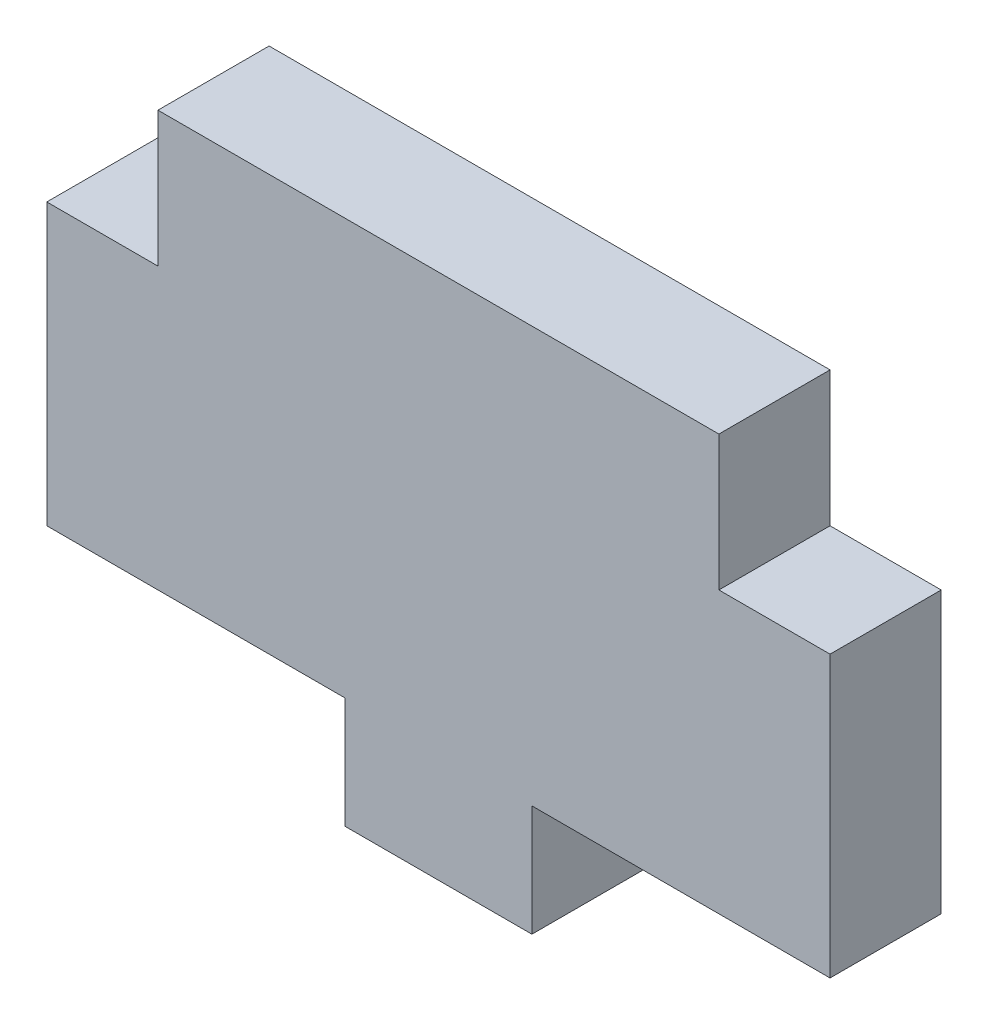
ISO-10303-21;
HEADER;
FILE_DESCRIPTION(('STEP AP214'),'2;1');
FILE_NAME('part.step','',(''),(''),'','','');
FILE_SCHEMA(('AUTOMOTIVE_DESIGN { 1 0 10303 214 1 1 1 1 }'));
ENDSEC;
DATA;
#1=APPLICATION_CONTEXT('core data for automotive mechanical design processes');
#2=APPLICATION_PROTOCOL_DEFINITION('international standard','automotive_design',2000,#1);
#3=PRODUCT_CONTEXT('',#1,'mechanical');
#4=PRODUCT('Part','Part','',(#3));
#5=PRODUCT_RELATED_PRODUCT_CATEGORY('part','',(#4));
#6=PRODUCT_DEFINITION_FORMATION('','',#4);
#7=PRODUCT_DEFINITION_CONTEXT('part definition',#1,'design');
#8=PRODUCT_DEFINITION('design','',#6,#7);
#9=PRODUCT_DEFINITION_SHAPE('','',#8);
#10=(LENGTH_UNIT() NAMED_UNIT(*) SI_UNIT(.MILLI.,.METRE.));
#11=(NAMED_UNIT(*) PLANE_ANGLE_UNIT() SI_UNIT($,.RADIAN.));
#12=(NAMED_UNIT(*) SI_UNIT($,.STERADIAN.) SOLID_ANGLE_UNIT());
#13=UNCERTAINTY_MEASURE_WITH_UNIT(LENGTH_MEASURE(1.E-05),#10,'distance_accuracy_value','');
#14=(GEOMETRIC_REPRESENTATION_CONTEXT(3) GLOBAL_UNCERTAINTY_ASSIGNED_CONTEXT((#13)) GLOBAL_UNIT_ASSIGNED_CONTEXT((#10,
#11,#12)) REPRESENTATION_CONTEXT('',''));
#15=CARTESIAN_POINT('',(0.,0.,0.));
#16=DIRECTION('',(0.,0.,1.));
#17=DIRECTION('',(1.,0.,0.));
#18=AXIS2_PLACEMENT_3D('',#15,#16,#17);
#19=CARTESIAN_POINT('',(32.349998597,18.8500005752,5.35));
#20=DIRECTION('',(-1.,0.,0.));
#21=DIRECTION('',(0.,0.,1.));
#22=AXIS2_PLACEMENT_3D('',#19,#20,#21);
#23=PLANE('',#22);
#24=DIRECTION('',(0.,1.,0.));
#25=VECTOR('',#24,1.);
#26=CARTESIAN_POINT('',(32.349998597,18.8500005752,0.));
#27=LINE('',#26,#25);
#28=CARTESIAN_POINT('',(32.349998597,18.8500005752,0.));
#29=VERTEX_POINT('',#28);
#30=CARTESIAN_POINT('',(32.349998597,25.349999778,0.));
#31=VERTEX_POINT('',#30);
#32=EDGE_CURVE('E153',#29,#31,#27,.T.);
#33=ORIENTED_EDGE('',*,*,#32,.T.);
#34=DIRECTION('',(0.,0.,-1.));
#35=VECTOR('',#34,1.);
#36=CARTESIAN_POINT('',(32.349998597,25.349999778,5.35));
#37=LINE('',#36,#35);
#38=CARTESIAN_POINT('',(32.349998597,25.349999778,5.35));
#39=VERTEX_POINT('',#38);
#40=EDGE_CURVE('E11',#39,#31,#37,.T.);
#41=ORIENTED_EDGE('',*,*,#40,.F.);
#42=DIRECTION('',(0.,1.,0.));
#43=VECTOR('',#42,1.);
#44=CARTESIAN_POINT('',(32.349998597,18.8500005752,5.35));
#45=LINE('',#44,#43);
#46=CARTESIAN_POINT('',(32.349998597,18.8500005752,5.35));
#47=VERTEX_POINT('',#46);
#48=EDGE_CURVE('E175',#47,#39,#45,.T.);
#49=ORIENTED_EDGE('',*,*,#48,.F.);
#50=DIRECTION('',(0.,0.,-1.));
#51=VECTOR('',#50,1.);
#52=CARTESIAN_POINT('',(32.349998597,18.8500005752,5.35));
#53=LINE('',#52,#51);
#54=EDGE_CURVE('E149',#47,#29,#53,.T.);
#55=ORIENTED_EDGE('',*,*,#54,.T.);
#56=EDGE_LOOP('',(#33,#41,#49,#55));
#57=FACE_BOUND('',#56,.T.);
#58=ADVANCED_FACE('F33',(#57),#23,.F.);
#59=CARTESIAN_POINT('',(32.349998597,25.349999778,5.35));
#60=DIRECTION('',(0.,-1.,0.));
#61=DIRECTION('',(0.,0.,-1.));
#62=AXIS2_PLACEMENT_3D('',#59,#60,#61);
#63=PLANE('',#62);
#64=DIRECTION('',(-1.,0.,0.));
#65=VECTOR('',#64,1.);
#66=CARTESIAN_POINT('',(32.349998597,25.349999778,0.));
#67=LINE('',#66,#65);
#68=CARTESIAN_POINT('',(5.35000022500001,25.349999778,0.));
#69=VERTEX_POINT('',#68);
#70=EDGE_CURVE('E156',#31,#69,#67,.T.);
#71=ORIENTED_EDGE('',*,*,#70,.T.);
#72=DIRECTION('',(0.,0.,-1.));
#73=VECTOR('',#72,1.);
#74=CARTESIAN_POINT('',(5.35000022500001,25.349999778,5.35));
#75=LINE('',#74,#73);
#76=CARTESIAN_POINT('',(5.35000022500001,25.349999778,5.35));
#77=VERTEX_POINT('',#76);
#78=EDGE_CURVE('E41',#77,#69,#75,.T.);
#79=ORIENTED_EDGE('',*,*,#78,.F.);
#80=DIRECTION('',(-1.,0.,0.));
#81=VECTOR('',#80,1.);
#82=CARTESIAN_POINT('',(32.349998597,25.349999778,5.35));
#83=LINE('',#82,#81);
#84=EDGE_CURVE('E104',#39,#77,#83,.T.);
#85=ORIENTED_EDGE('',*,*,#84,.F.);
#86=ORIENTED_EDGE('',*,*,#40,.T.);
#87=EDGE_LOOP('',(#71,#79,#85,#86));
#88=FACE_BOUND('',#87,.T.);
#89=ADVANCED_FACE('F253',(#88),#63,.F.);
#90=CARTESIAN_POINT('',(5.35000022500001,25.349999778,5.35));
#91=DIRECTION('',(1.,0.,0.));
#92=DIRECTION('',(0.,0.,-1.));
#93=AXIS2_PLACEMENT_3D('',#90,#91,#92);
#94=PLANE('',#93);
#95=DIRECTION('',(0.,-1.,0.));
#96=VECTOR('',#95,1.);
#97=CARTESIAN_POINT('',(5.35000022500001,25.349999778,0.));
#98=LINE('',#97,#96);
#99=CARTESIAN_POINT('',(5.35000022500001,18.8500005752,0.));
#100=VERTEX_POINT('',#99);
#101=EDGE_CURVE('E158',#69,#100,#98,.T.);
#102=ORIENTED_EDGE('',*,*,#101,.T.);
#103=DIRECTION('',(0.,0.,-1.));
#104=VECTOR('',#103,1.);
#105=CARTESIAN_POINT('',(5.35000022500001,18.8500005752,5.35));
#106=LINE('',#105,#104);
#107=CARTESIAN_POINT('',(5.35000022500001,18.8500005752,5.35));
#108=VERTEX_POINT('',#107);
#109=EDGE_CURVE('E194',#108,#100,#106,.T.);
#110=ORIENTED_EDGE('',*,*,#109,.F.);
#111=DIRECTION('',(0.,-1.,0.));
#112=VECTOR('',#111,1.);
#113=CARTESIAN_POINT('',(5.35000022500001,25.349999778,5.35));
#114=LINE('',#113,#112);
#115=EDGE_CURVE('E202',#77,#108,#114,.T.);
#116=ORIENTED_EDGE('',*,*,#115,.F.);
#117=ORIENTED_EDGE('',*,*,#78,.T.);
#118=EDGE_LOOP('',(#102,#110,#116,#117));
#119=FACE_BOUND('',#118,.T.);
#120=ADVANCED_FACE('F200',(#119),#94,.F.);
#121=CARTESIAN_POINT('',(5.35000022500001,18.8500005752,5.35));
#122=DIRECTION('',(0.,-1.,0.));
#123=DIRECTION('',(0.,0.,-1.));
#124=AXIS2_PLACEMENT_3D('',#121,#122,#123);
#125=PLANE('',#124);
#126=DIRECTION('',(-1.,0.,0.));
#127=VECTOR('',#126,1.);
#128=CARTESIAN_POINT('',(5.35000022500001,18.8500005752,0.));
#129=LINE('',#128,#127);
#130=CARTESIAN_POINT('',(0.,18.8500005752,0.));
#131=VERTEX_POINT('',#130);
#132=EDGE_CURVE('E160',#100,#131,#129,.T.);
#133=ORIENTED_EDGE('',*,*,#132,.T.);
#134=DIRECTION('',(0.,0.,-1.));
#135=VECTOR('',#134,1.);
#136=CARTESIAN_POINT('',(0.,18.8500005752,5.35));
#137=LINE('',#136,#135);
#138=CARTESIAN_POINT('',(0.,18.8500005752,5.35));
#139=VERTEX_POINT('',#138);
#140=EDGE_CURVE('E191',#139,#131,#137,.T.);
#141=ORIENTED_EDGE('',*,*,#140,.F.);
#142=DIRECTION('',(-1.,0.,0.));
#143=VECTOR('',#142,1.);
#144=CARTESIAN_POINT('',(5.35000022500001,18.8500005752,5.35));
#145=LINE('',#144,#143);
#146=EDGE_CURVE('E220',#108,#139,#145,.T.);
#147=ORIENTED_EDGE('',*,*,#146,.F.);
#148=ORIENTED_EDGE('',*,*,#109,.T.);
#149=EDGE_LOOP('',(#133,#141,#147,#148));
#150=FACE_BOUND('',#149,.T.);
#151=ADVANCED_FACE('F211',(#150),#125,.F.);
#152=CARTESIAN_POINT('',(0.,18.8500005752,5.35));
#153=DIRECTION('',(1.,0.,0.));
#154=DIRECTION('',(0.,0.,-1.));
#155=AXIS2_PLACEMENT_3D('',#152,#153,#154);
#156=PLANE('',#155);
#157=DIRECTION('',(0.,-1.,0.));
#158=VECTOR('',#157,1.);
#159=CARTESIAN_POINT('',(0.,18.8500005752,0.));
#160=LINE('',#159,#158);
#161=CARTESIAN_POINT('',(0.,5.350000225,0.));
#162=VERTEX_POINT('',#161);
#163=EDGE_CURVE('E162',#131,#162,#160,.T.);
#164=ORIENTED_EDGE('',*,*,#163,.T.);
#165=DIRECTION('',(0.,0.,-1.));
#166=VECTOR('',#165,1.);
#167=CARTESIAN_POINT('',(0.,5.350000225,5.35));
#168=LINE('',#167,#166);
#169=CARTESIAN_POINT('',(0.,5.350000225,5.35));
#170=VERTEX_POINT('',#169);
#171=EDGE_CURVE('E188',#170,#162,#168,.T.);
#172=ORIENTED_EDGE('',*,*,#171,.F.);
#173=DIRECTION('',(0.,-1.,0.));
#174=VECTOR('',#173,1.);
#175=CARTESIAN_POINT('',(0.,18.8500005752,5.35));
#176=LINE('',#175,#174);
#177=EDGE_CURVE('E217',#139,#170,#176,.T.);
#178=ORIENTED_EDGE('',*,*,#177,.F.);
#179=ORIENTED_EDGE('',*,*,#140,.T.);
#180=EDGE_LOOP('',(#164,#172,#178,#179));
#181=FACE_BOUND('',#180,.T.);
#182=ADVANCED_FACE('F215',(#181),#156,.F.);
#183=CARTESIAN_POINT('',(0.,5.350000225,5.35));
#184=DIRECTION('',(0.,1.,0.));
#185=DIRECTION('',(0.,0.,1.));
#186=AXIS2_PLACEMENT_3D('',#183,#184,#185);
#187=PLANE('',#186);
#188=DIRECTION('',(1.,0.,0.));
#189=VECTOR('',#188,1.);
#190=CARTESIAN_POINT('',(0.,5.350000225,0.));
#191=LINE('',#190,#189);
#192=CARTESIAN_POINT('',(14.3499993719,5.350000225,0.));
#193=VERTEX_POINT('',#192);
#194=EDGE_CURVE('E164',#162,#193,#191,.T.);
#195=ORIENTED_EDGE('',*,*,#194,.T.);
#196=DIRECTION('',(0.,0.,-1.));
#197=VECTOR('',#196,1.);
#198=CARTESIAN_POINT('',(14.3499993719,5.350000225,5.35));
#199=LINE('',#198,#197);
#200=CARTESIAN_POINT('',(14.3499993719,5.350000225,5.35));
#201=VERTEX_POINT('',#200);
#202=EDGE_CURVE('E185',#201,#193,#199,.T.);
#203=ORIENTED_EDGE('',*,*,#202,.F.);
#204=DIRECTION('',(1.,0.,0.));
#205=VECTOR('',#204,1.);
#206=CARTESIAN_POINT('',(0.,5.350000225,5.35));
#207=LINE('',#206,#205);
#208=EDGE_CURVE('E219',#170,#201,#207,.T.);
#209=ORIENTED_EDGE('',*,*,#208,.F.);
#210=ORIENTED_EDGE('',*,*,#171,.T.);
#211=EDGE_LOOP('',(#195,#203,#209,#210));
#212=FACE_BOUND('',#211,.T.);
#213=ADVANCED_FACE('F266',(#212),#187,.F.);
#214=CARTESIAN_POINT('',(14.3499993719,5.350000225,5.35));
#215=DIRECTION('',(1.,0.,0.));
#216=DIRECTION('',(0.,0.,-1.));
#217=AXIS2_PLACEMENT_3D('',#214,#215,#216);
#218=PLANE('',#217);
#219=DIRECTION('',(0.,-1.,0.));
#220=VECTOR('',#219,1.);
#221=CARTESIAN_POINT('',(14.3499993719,5.350000225,0.));
#222=LINE('',#221,#220);
#223=CARTESIAN_POINT('',(14.3499993719,0.,0.));
#224=VERTEX_POINT('',#223);
#225=EDGE_CURVE('E166',#193,#224,#222,.T.);
#226=ORIENTED_EDGE('',*,*,#225,.T.);
#227=DIRECTION('',(0.,0.,-1.));
#228=VECTOR('',#227,1.);
#229=CARTESIAN_POINT('',(14.3499993719,0.,5.35));
#230=LINE('',#229,#228);
#231=CARTESIAN_POINT('',(14.3499993719,0.,5.35));
#232=VERTEX_POINT('',#231);
#233=EDGE_CURVE('E182',#232,#224,#230,.T.);
#234=ORIENTED_EDGE('',*,*,#233,.F.);
#235=DIRECTION('',(0.,-1.,0.));
#236=VECTOR('',#235,1.);
#237=CARTESIAN_POINT('',(14.3499993719,5.350000225,5.35));
#238=LINE('',#237,#236);
#239=EDGE_CURVE('E222',#201,#232,#238,.T.);
#240=ORIENTED_EDGE('',*,*,#239,.F.);
#241=ORIENTED_EDGE('',*,*,#202,.T.);
#242=EDGE_LOOP('',(#226,#234,#240,#241));
#243=FACE_BOUND('',#242,.T.);
#244=ADVANCED_FACE('F269',(#243),#218,.F.);
#245=CARTESIAN_POINT('',(14.3499993719,0.,5.35));
#246=DIRECTION('',(0.,1.,0.));
#247=DIRECTION('',(0.,0.,1.));
#248=AXIS2_PLACEMENT_3D('',#245,#246,#247);
#249=PLANE('',#248);
#250=DIRECTION('',(1.,0.,0.));
#251=VECTOR('',#250,1.);
#252=CARTESIAN_POINT('',(14.3499993719,0.,0.));
#253=LINE('',#252,#251);
#254=CARTESIAN_POINT('',(23.3500008471,0.,0.));
#255=VERTEX_POINT('',#254);
#256=EDGE_CURVE('E168',#224,#255,#253,.T.);
#257=ORIENTED_EDGE('',*,*,#256,.T.);
#258=DIRECTION('',(0.,0.,-1.));
#259=VECTOR('',#258,1.);
#260=CARTESIAN_POINT('',(23.3500008471,0.,5.35));
#261=LINE('',#260,#259);
#262=CARTESIAN_POINT('',(23.3500008471,0.,5.35));
#263=VERTEX_POINT('',#262);
#264=EDGE_CURVE('E179',#263,#255,#261,.T.);
#265=ORIENTED_EDGE('',*,*,#264,.F.);
#266=DIRECTION('',(1.,0.,0.));
#267=VECTOR('',#266,1.);
#268=CARTESIAN_POINT('',(14.3499993719,0.,5.35));
#269=LINE('',#268,#267);
#270=EDGE_CURVE('E228',#232,#263,#269,.T.);
#271=ORIENTED_EDGE('',*,*,#270,.F.);
#272=ORIENTED_EDGE('',*,*,#233,.T.);
#273=EDGE_LOOP('',(#257,#265,#271,#272));
#274=FACE_BOUND('',#273,.T.);
#275=ADVANCED_FACE('F234',(#274),#249,.F.);
#276=CARTESIAN_POINT('',(23.3500008471,0.,5.35));
#277=DIRECTION('',(-1.,0.,0.));
#278=DIRECTION('',(0.,0.,1.));
#279=AXIS2_PLACEMENT_3D('',#276,#277,#278);
#280=PLANE('',#279);
#281=DIRECTION('',(0.,1.,0.));
#282=VECTOR('',#281,1.);
#283=CARTESIAN_POINT('',(23.3500008471,0.,0.));
#284=LINE('',#283,#282);
#285=CARTESIAN_POINT('',(23.3500008471,5.350000225,0.));
#286=VERTEX_POINT('',#285);
#287=EDGE_CURVE('E170',#255,#286,#284,.T.);
#288=ORIENTED_EDGE('',*,*,#287,.T.);
#289=DIRECTION('',(0.,0.,-1.));
#290=VECTOR('',#289,1.);
#291=CARTESIAN_POINT('',(23.3500008471,5.350000225,5.35));
#292=LINE('',#291,#290);
#293=CARTESIAN_POINT('',(23.3500008471,5.350000225,5.35));
#294=VERTEX_POINT('',#293);
#295=EDGE_CURVE('E144',#294,#286,#292,.T.);
#296=ORIENTED_EDGE('',*,*,#295,.F.);
#297=DIRECTION('',(0.,1.,0.));
#298=VECTOR('',#297,1.);
#299=CARTESIAN_POINT('',(23.3500008471,0.,5.35));
#300=LINE('',#299,#298);
#301=EDGE_CURVE('E135',#263,#294,#300,.T.);
#302=ORIENTED_EDGE('',*,*,#301,.F.);
#303=ORIENTED_EDGE('',*,*,#264,.T.);
#304=EDGE_LOOP('',(#288,#296,#302,#303));
#305=FACE_BOUND('',#304,.T.);
#306=ADVANCED_FACE('F238',(#305),#280,.F.);
#307=CARTESIAN_POINT('',(23.3500008471,5.350000225,5.35));
#308=DIRECTION('',(0.,1.,0.));
#309=DIRECTION('',(0.,0.,1.));
#310=AXIS2_PLACEMENT_3D('',#307,#308,#309);
#311=PLANE('',#310);
#312=DIRECTION('',(1.,0.,0.));
#313=VECTOR('',#312,1.);
#314=CARTESIAN_POINT('',(23.3500008471,5.350000225,0.));
#315=LINE('',#314,#313);
#316=CARTESIAN_POINT('',(37.6999997534001,5.350000225,0.));
#317=VERTEX_POINT('',#316);
#318=EDGE_CURVE('E143',#286,#317,#315,.T.);
#319=ORIENTED_EDGE('',*,*,#318,.T.);
#320=DIRECTION('',(0.,0.,-1.));
#321=VECTOR('',#320,1.);
#322=CARTESIAN_POINT('',(37.6999997534001,5.350000225,5.35));
#323=LINE('',#322,#321);
#324=CARTESIAN_POINT('',(37.6999997534001,5.350000225,5.35));
#325=VERTEX_POINT('',#324);
#326=EDGE_CURVE('E140',#325,#317,#323,.T.);
#327=ORIENTED_EDGE('',*,*,#326,.F.);
#328=DIRECTION('',(1.,0.,0.));
#329=VECTOR('',#328,1.);
#330=CARTESIAN_POINT('',(23.3500008471,5.350000225,5.35));
#331=LINE('',#330,#329);
#332=EDGE_CURVE('E129',#294,#325,#331,.T.);
#333=ORIENTED_EDGE('',*,*,#332,.F.);
#334=ORIENTED_EDGE('',*,*,#295,.T.);
#335=EDGE_LOOP('',(#319,#327,#333,#334));
#336=FACE_BOUND('',#335,.T.);
#337=ADVANCED_FACE('F141',(#336),#311,.F.);
#338=CARTESIAN_POINT('',(37.6999997534001,5.350000225,5.35));
#339=DIRECTION('',(-1.,0.,0.));
#340=DIRECTION('',(0.,0.,1.));
#341=AXIS2_PLACEMENT_3D('',#338,#339,#340);
#342=PLANE('',#341);
#343=DIRECTION('',(0.,1.,0.));
#344=VECTOR('',#343,1.);
#345=CARTESIAN_POINT('',(37.6999997534001,5.350000225,0.));
#346=LINE('',#345,#344);
#347=CARTESIAN_POINT('',(37.6999997534001,18.8500005752,0.));
#348=VERTEX_POINT('',#347);
#349=EDGE_CURVE('E90',#317,#348,#346,.T.);
#350=ORIENTED_EDGE('',*,*,#349,.T.);
#351=DIRECTION('',(0.,0.,-1.));
#352=VECTOR('',#351,1.);
#353=CARTESIAN_POINT('',(37.6999997534001,18.8500005752,5.35));
#354=LINE('',#353,#352);
#355=CARTESIAN_POINT('',(37.6999997534001,18.8500005752,5.35));
#356=VERTEX_POINT('',#355);
#357=EDGE_CURVE('E145',#356,#348,#354,.T.);
#358=ORIENTED_EDGE('',*,*,#357,.F.);
#359=DIRECTION('',(0.,1.,0.));
#360=VECTOR('',#359,1.);
#361=CARTESIAN_POINT('',(37.6999997534001,5.350000225,5.35));
#362=LINE('',#361,#360);
#363=EDGE_CURVE('E133',#325,#356,#362,.T.);
#364=ORIENTED_EDGE('',*,*,#363,.F.);
#365=ORIENTED_EDGE('',*,*,#326,.T.);
#366=EDGE_LOOP('',(#350,#358,#364,#365));
#367=FACE_BOUND('',#366,.T.);
#368=ADVANCED_FACE('F147',(#367),#342,.F.);
#369=CARTESIAN_POINT('',(37.6999997534001,18.8500005752,5.35));
#370=DIRECTION('',(0.,-1.,0.));
#371=DIRECTION('',(0.,0.,-1.));
#372=AXIS2_PLACEMENT_3D('',#369,#370,#371);
#373=PLANE('',#372);
#374=DIRECTION('',(-1.,0.,0.));
#375=VECTOR('',#374,1.);
#376=CARTESIAN_POINT('',(37.6999997534001,18.8500005752,0.));
#377=LINE('',#376,#375);
#378=EDGE_CURVE('E96',#348,#29,#377,.T.);
#379=ORIENTED_EDGE('',*,*,#378,.T.);
#380=ORIENTED_EDGE('',*,*,#54,.F.);
#381=DIRECTION('',(-1.,0.,0.));
#382=VECTOR('',#381,1.);
#383=CARTESIAN_POINT('',(37.6999997534001,18.8500005752,5.35));
#384=LINE('',#383,#382);
#385=EDGE_CURVE('E49',#356,#47,#384,.T.);
#386=ORIENTED_EDGE('',*,*,#385,.F.);
#387=ORIENTED_EDGE('',*,*,#357,.T.);
#388=EDGE_LOOP('',(#379,#380,#386,#387));
#389=FACE_BOUND('',#388,.T.);
#390=ADVANCED_FACE('F242',(#389),#373,.F.);
#391=CARTESIAN_POINT('',(0.,0.,5.35));
#392=DIRECTION('',(0.,0.,1.));
#393=DIRECTION('',(1.,0.,0.));
#394=AXIS2_PLACEMENT_3D('',#391,#392,#393);
#395=PLANE('',#394);
#396=ORIENTED_EDGE('',*,*,#48,.T.);
#397=ORIENTED_EDGE('',*,*,#84,.T.);
#398=ORIENTED_EDGE('',*,*,#115,.T.);
#399=ORIENTED_EDGE('',*,*,#146,.T.);
#400=ORIENTED_EDGE('',*,*,#177,.T.);
#401=ORIENTED_EDGE('',*,*,#208,.T.);
#402=ORIENTED_EDGE('',*,*,#239,.T.);
#403=ORIENTED_EDGE('',*,*,#270,.T.);
#404=ORIENTED_EDGE('',*,*,#301,.T.);
#405=ORIENTED_EDGE('',*,*,#332,.T.);
#406=ORIENTED_EDGE('',*,*,#363,.T.);
#407=ORIENTED_EDGE('',*,*,#385,.T.);
#408=EDGE_LOOP('',(#396,#397,#398,#399,#400,#401,#402,#403,#404,#405,#406,#407));
#409=FACE_BOUND('',#408,.T.);
#410=ADVANCED_FACE('F131',(#409),#395,.T.);
#411=CARTESIAN_POINT('',(0.,0.,0.));
#412=DIRECTION('',(0.,0.,1.));
#413=DIRECTION('',(1.,0.,0.));
#414=AXIS2_PLACEMENT_3D('',#411,#412,#413);
#415=PLANE('',#414);
#416=ORIENTED_EDGE('',*,*,#32,.F.);
#417=ORIENTED_EDGE('',*,*,#378,.F.);
#418=ORIENTED_EDGE('',*,*,#349,.F.);
#419=ORIENTED_EDGE('',*,*,#318,.F.);
#420=ORIENTED_EDGE('',*,*,#287,.F.);
#421=ORIENTED_EDGE('',*,*,#256,.F.);
#422=ORIENTED_EDGE('',*,*,#225,.F.);
#423=ORIENTED_EDGE('',*,*,#194,.F.);
#424=ORIENTED_EDGE('',*,*,#163,.F.);
#425=ORIENTED_EDGE('',*,*,#132,.F.);
#426=ORIENTED_EDGE('',*,*,#101,.F.);
#427=ORIENTED_EDGE('',*,*,#70,.F.);
#428=EDGE_LOOP('',(#416,#417,#418,#419,#420,#421,#422,#423,#424,#425,#426,#427));
#429=FACE_BOUND('',#428,.T.);
#430=ADVANCED_FACE('F206',(#429),#415,.F.);
#431=CLOSED_SHELL('',(#58,#89,#120,#151,#182,#213,#244,#275,#306,#337,#368,#390,#410,#430));
#432=MANIFOLD_SOLID_BREP('B2',#431);
#433=ADVANCED_BREP_SHAPE_REPRESENTATION('',(#18,#432),#14);
#434=SHAPE_DEFINITION_REPRESENTATION(#9,#433);
ENDSEC;
END-ISO-10303-21;
